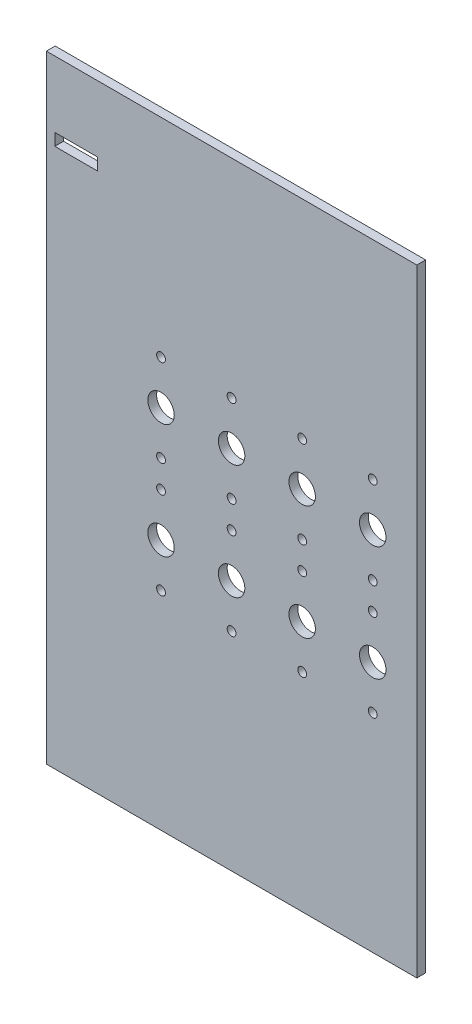
ISO-10303-21;
HEADER;
FILE_DESCRIPTION(('STEP AP214'),'2;1');
FILE_NAME('part.step','',(''),(''),'','','');
FILE_SCHEMA(('AUTOMOTIVE_DESIGN { 1 0 10303 214 1 1 1 1 }'));
ENDSEC;
DATA;
#1=APPLICATION_CONTEXT('core data for automotive mechanical design processes');
#2=APPLICATION_PROTOCOL_DEFINITION('international standard','automotive_design',2000,#1);
#3=PRODUCT_CONTEXT('',#1,'mechanical');
#4=PRODUCT('Part','Part','',(#3));
#5=PRODUCT_RELATED_PRODUCT_CATEGORY('part','',(#4));
#6=PRODUCT_DEFINITION_FORMATION('','',#4);
#7=PRODUCT_DEFINITION_CONTEXT('part definition',#1,'design');
#8=PRODUCT_DEFINITION('design','',#6,#7);
#9=PRODUCT_DEFINITION_SHAPE('','',#8);
#10=(LENGTH_UNIT() NAMED_UNIT(*) SI_UNIT(.MILLI.,.METRE.));
#11=(NAMED_UNIT(*) PLANE_ANGLE_UNIT() SI_UNIT($,.RADIAN.));
#12=(NAMED_UNIT(*) SI_UNIT($,.STERADIAN.) SOLID_ANGLE_UNIT());
#13=UNCERTAINTY_MEASURE_WITH_UNIT(LENGTH_MEASURE(1.E-05),#10,'distance_accuracy_value','');
#14=(GEOMETRIC_REPRESENTATION_CONTEXT(3) GLOBAL_UNCERTAINTY_ASSIGNED_CONTEXT((#13)) GLOBAL_UNIT_ASSIGNED_CONTEXT((#10,
#11,#12)) REPRESENTATION_CONTEXT('',''));
#15=CARTESIAN_POINT('',(0.,0.,0.));
#16=DIRECTION('',(0.,0.,1.));
#17=DIRECTION('',(1.,0.,0.));
#18=AXIS2_PLACEMENT_3D('',#15,#16,#17);
#19=CARTESIAN_POINT('',(0.,0.,10.));
#20=DIRECTION('',(0.,0.,1.));
#21=DIRECTION('',(1.,0.,0.));
#22=AXIS2_PLACEMENT_3D('',#19,#20,#21);
#23=PLANE('',#22);
#24=DIRECTION('',(0.,-1.,0.));
#25=VECTOR('',#24,1.);
#26=CARTESIAN_POINT('',(57.76,261.29,10.));
#27=LINE('',#26,#25);
#28=CARTESIAN_POINT('',(57.76,275.,10.));
#29=VERTEX_POINT('',#28);
#30=CARTESIAN_POINT('',(57.76,261.29,10.));
#31=VERTEX_POINT('',#30);
#32=EDGE_CURVE('E106',#29,#31,#27,.T.);
#33=ORIENTED_EDGE('',*,*,#32,.T.);
#34=DIRECTION('',(-1.,0.,0.));
#35=VECTOR('',#34,1.);
#36=CARTESIAN_POINT('',(9.53,261.29,10.));
#37=LINE('',#36,#35);
#38=CARTESIAN_POINT('',(9.53,261.29,10.));
#39=VERTEX_POINT('',#38);
#40=EDGE_CURVE('E113',#31,#39,#37,.T.);
#41=ORIENTED_EDGE('',*,*,#40,.T.);
#42=DIRECTION('',(0.,1.,0.));
#43=VECTOR('',#42,1.);
#44=CARTESIAN_POINT('',(9.53,261.29,10.));
#45=LINE('',#44,#43);
#46=CARTESIAN_POINT('',(9.53,275.,10.));
#47=VERTEX_POINT('',#46);
#48=EDGE_CURVE('E53',#39,#47,#45,.T.);
#49=ORIENTED_EDGE('',*,*,#48,.T.);
#50=DIRECTION('',(1.,0.,0.));
#51=VECTOR('',#50,1.);
#52=CARTESIAN_POINT('',(9.53,275.,10.));
#53=LINE('',#52,#51);
#54=EDGE_CURVE('E115',#47,#29,#53,.T.);
#55=ORIENTED_EDGE('',*,*,#54,.T.);
#56=EDGE_LOOP('',(#33,#41,#49,#55));
#57=FACE_BOUND('',#56,.T.);
#58=CARTESIAN_POINT('',(290.,-64.9999999999999,10.));
#59=DIRECTION('',(0.,0.,1.));
#60=DIRECTION('',(1.,0.,0.));
#61=AXIS2_PLACEMENT_3D('',#58,#59,#60);
#62=CIRCLE('',#61,15.0000000000001);
#63=CARTESIAN_POINT('',(305.,-64.9999999999999,10.));
#64=VERTEX_POINT('',#63);
#65=EDGE_CURVE('E148',#64,#64,#62,.T.);
#66=ORIENTED_EDGE('',*,*,#65,.F.);
#67=EDGE_LOOP('',(#66));
#68=FACE_BOUND('',#67,.T.);
#69=CARTESIAN_POINT('',(129.999999999999,-64.9999999999999,10.));
#70=DIRECTION('',(0.,0.,1.));
#71=DIRECTION('',(1.,0.,0.));
#72=AXIS2_PLACEMENT_3D('',#69,#70,#71);
#73=CIRCLE('',#72,15.0000000000001);
#74=CARTESIAN_POINT('',(145.,-64.9999999999999,10.));
#75=VERTEX_POINT('',#74);
#76=EDGE_CURVE('E158',#75,#75,#73,.T.);
#77=ORIENTED_EDGE('',*,*,#76,.F.);
#78=EDGE_LOOP('',(#77));
#79=FACE_BOUND('',#78,.T.);
#80=CARTESIAN_POINT('',(370.,-114.5,10.));
#81=DIRECTION('',(0.,0.,1.));
#82=DIRECTION('',(1.,0.,0.));
#83=AXIS2_PLACEMENT_3D('',#80,#81,#82);
#84=CIRCLE('',#83,4.99999999999989);
#85=CARTESIAN_POINT('',(375.,-114.5,10.));
#86=VERTEX_POINT('',#85);
#87=EDGE_CURVE('E168',#86,#86,#84,.T.);
#88=ORIENTED_EDGE('',*,*,#87,.F.);
#89=EDGE_LOOP('',(#88));
#90=FACE_BOUND('',#89,.T.);
#91=CARTESIAN_POINT('',(290.,-114.5,10.));
#92=DIRECTION('',(0.,0.,1.));
#93=DIRECTION('',(1.,0.,0.));
#94=AXIS2_PLACEMENT_3D('',#91,#92,#93);
#95=CIRCLE('',#94,4.99999999999989);
#96=CARTESIAN_POINT('',(294.999999999999,-114.5,10.));
#97=VERTEX_POINT('',#96);
#98=EDGE_CURVE('E185',#97,#97,#95,.T.);
#99=ORIENTED_EDGE('',*,*,#98,.F.);
#100=EDGE_LOOP('',(#99));
#101=FACE_BOUND('',#100,.T.);
#102=CARTESIAN_POINT('',(210.,-114.5,10.));
#103=DIRECTION('',(0.,0.,1.));
#104=DIRECTION('',(1.,0.,0.));
#105=AXIS2_PLACEMENT_3D('',#102,#103,#104);
#106=CIRCLE('',#105,4.99999999999989);
#107=CARTESIAN_POINT('',(214.999999999999,-114.5,10.));
#108=VERTEX_POINT('',#107);
#109=EDGE_CURVE('E194',#108,#108,#106,.T.);
#110=ORIENTED_EDGE('',*,*,#109,.F.);
#111=EDGE_LOOP('',(#110));
#112=FACE_BOUND('',#111,.T.);
#113=CARTESIAN_POINT('',(129.999999999999,-114.5,10.));
#114=DIRECTION('',(0.,0.,1.));
#115=DIRECTION('',(1.,0.,0.));
#116=AXIS2_PLACEMENT_3D('',#113,#114,#115);
#117=CIRCLE('',#116,4.99999999999989);
#118=CARTESIAN_POINT('',(134.999999999999,-114.5,10.));
#119=VERTEX_POINT('',#118);
#120=EDGE_CURVE('E206',#119,#119,#117,.T.);
#121=ORIENTED_EDGE('',*,*,#120,.F.);
#122=EDGE_LOOP('',(#121));
#123=FACE_BOUND('',#122,.T.);
#124=CARTESIAN_POINT('',(290.,64.9999999999999,10.));
#125=DIRECTION('',(0.,0.,1.));
#126=DIRECTION('',(1.,0.,0.));
#127=AXIS2_PLACEMENT_3D('',#124,#125,#126);
#128=CIRCLE('',#127,15.0000000000001);
#129=CARTESIAN_POINT('',(305.,64.9999999999999,10.));
#130=VERTEX_POINT('',#129);
#131=EDGE_CURVE('E217',#130,#130,#128,.T.);
#132=ORIENTED_EDGE('',*,*,#131,.F.);
#133=EDGE_LOOP('',(#132));
#134=FACE_BOUND('',#133,.T.);
#135=CARTESIAN_POINT('',(129.999999999999,64.9999999999999,10.));
#136=DIRECTION('',(0.,0.,1.));
#137=DIRECTION('',(1.,0.,0.));
#138=AXIS2_PLACEMENT_3D('',#135,#136,#137);
#139=CIRCLE('',#138,15.0000000000001);
#140=CARTESIAN_POINT('',(145.,64.9999999999999,10.));
#141=VERTEX_POINT('',#140);
#142=EDGE_CURVE('E230',#141,#141,#139,.T.);
#143=ORIENTED_EDGE('',*,*,#142,.F.);
#144=EDGE_LOOP('',(#143));
#145=FACE_BOUND('',#144,.T.);
#146=CARTESIAN_POINT('',(370.,114.5,10.));
#147=DIRECTION('',(0.,0.,1.));
#148=DIRECTION('',(1.,0.,0.));
#149=AXIS2_PLACEMENT_3D('',#146,#147,#148);
#150=CIRCLE('',#149,4.99999999999989);
#151=CARTESIAN_POINT('',(375.,114.5,10.));
#152=VERTEX_POINT('',#151);
#153=EDGE_CURVE('E242',#152,#152,#150,.T.);
#154=ORIENTED_EDGE('',*,*,#153,.F.);
#155=EDGE_LOOP('',(#154));
#156=FACE_BOUND('',#155,.T.);
#157=CARTESIAN_POINT('',(290.,114.5,10.));
#158=DIRECTION('',(0.,0.,1.));
#159=DIRECTION('',(1.,0.,0.));
#160=AXIS2_PLACEMENT_3D('',#157,#158,#159);
#161=CIRCLE('',#160,4.99999999999989);
#162=CARTESIAN_POINT('',(294.999999999999,114.5,10.));
#163=VERTEX_POINT('',#162);
#164=EDGE_CURVE('E255',#163,#163,#161,.T.);
#165=ORIENTED_EDGE('',*,*,#164,.F.);
#166=EDGE_LOOP('',(#165));
#167=FACE_BOUND('',#166,.T.);
#168=CARTESIAN_POINT('',(210.,114.5,10.));
#169=DIRECTION('',(0.,0.,1.));
#170=DIRECTION('',(1.,0.,0.));
#171=AXIS2_PLACEMENT_3D('',#168,#169,#170);
#172=CIRCLE('',#171,4.99999999999989);
#173=CARTESIAN_POINT('',(214.999999999999,114.5,10.));
#174=VERTEX_POINT('',#173);
#175=EDGE_CURVE('E266',#174,#174,#172,.T.);
#176=ORIENTED_EDGE('',*,*,#175,.F.);
#177=EDGE_LOOP('',(#176));
#178=FACE_BOUND('',#177,.T.);
#179=CARTESIAN_POINT('',(129.999999999999,114.5,10.));
#180=DIRECTION('',(0.,0.,1.));
#181=DIRECTION('',(1.,0.,0.));
#182=AXIS2_PLACEMENT_3D('',#179,#180,#181);
#183=CIRCLE('',#182,4.99999999999989);
#184=CARTESIAN_POINT('',(134.999999999999,114.5,10.));
#185=VERTEX_POINT('',#184);
#186=EDGE_CURVE('E279',#185,#185,#183,.T.);
#187=ORIENTED_EDGE('',*,*,#186,.F.);
#188=EDGE_LOOP('',(#187));
#189=FACE_BOUND('',#188,.T.);
#190=DIRECTION('',(0.,-1.,0.));
#191=VECTOR('',#190,1.);
#192=CARTESIAN_POINT('',(0.,350.,10.));
#193=LINE('',#192,#191);
#194=CARTESIAN_POINT('',(0.,350.,10.));
#195=VERTEX_POINT('',#194);
#196=CARTESIAN_POINT('',(0.,-350.,10.));
#197=VERTEX_POINT('',#196);
#198=EDGE_CURVE('E283',#195,#197,#193,.T.);
#199=ORIENTED_EDGE('',*,*,#198,.T.);
#200=DIRECTION('',(1.,0.,0.));
#201=VECTOR('',#200,1.);
#202=CARTESIAN_POINT('',(0.,-350.,10.));
#203=LINE('',#202,#201);
#204=CARTESIAN_POINT('',(419.999999999999,-350.,10.));
#205=VERTEX_POINT('',#204);
#206=EDGE_CURVE('E290',#197,#205,#203,.T.);
#207=ORIENTED_EDGE('',*,*,#206,.T.);
#208=DIRECTION('',(0.,1.,0.));
#209=VECTOR('',#208,1.);
#210=CARTESIAN_POINT('',(419.999999999999,-350.,10.));
#211=LINE('',#210,#209);
#212=CARTESIAN_POINT('',(419.999999999999,350.,10.));
#213=VERTEX_POINT('',#212);
#214=EDGE_CURVE('E286',#205,#213,#211,.T.);
#215=ORIENTED_EDGE('',*,*,#214,.T.);
#216=DIRECTION('',(-1.,0.,0.));
#217=VECTOR('',#216,1.);
#218=CARTESIAN_POINT('',(419.999999999999,350.,10.));
#219=LINE('',#218,#217);
#220=EDGE_CURVE('E295',#213,#195,#219,.T.);
#221=ORIENTED_EDGE('',*,*,#220,.T.);
#222=EDGE_LOOP('',(#199,#207,#215,#221));
#223=FACE_BOUND('',#222,.T.);
#224=CARTESIAN_POINT('',(129.999999999999,15.4999999999998,10.));
#225=DIRECTION('',(0.,0.,1.));
#226=DIRECTION('',(1.,0.,0.));
#227=AXIS2_PLACEMENT_3D('',#224,#225,#226);
#228=CIRCLE('',#227,4.99999999999989);
#229=CARTESIAN_POINT('',(134.999999999999,15.4999999999998,10.));
#230=VERTEX_POINT('',#229);
#231=EDGE_CURVE('E275',#230,#230,#228,.T.);
#232=ORIENTED_EDGE('',*,*,#231,.F.);
#233=EDGE_LOOP('',(#232));
#234=FACE_BOUND('',#233,.T.);
#235=CARTESIAN_POINT('',(210.,15.4999999999998,10.));
#236=DIRECTION('',(0.,0.,1.));
#237=DIRECTION('',(1.,0.,0.));
#238=AXIS2_PLACEMENT_3D('',#235,#236,#237);
#239=CIRCLE('',#238,4.99999999999989);
#240=CARTESIAN_POINT('',(214.999999999999,15.4999999999998,10.));
#241=VERTEX_POINT('',#240);
#242=EDGE_CURVE('E257',#241,#241,#239,.T.);
#243=ORIENTED_EDGE('',*,*,#242,.F.);
#244=EDGE_LOOP('',(#243));
#245=FACE_BOUND('',#244,.T.);
#246=CARTESIAN_POINT('',(290.,15.4999999999998,10.));
#247=DIRECTION('',(0.,0.,1.));
#248=DIRECTION('',(1.,0.,0.));
#249=AXIS2_PLACEMENT_3D('',#246,#247,#248);
#250=CIRCLE('',#249,4.99999999999989);
#251=CARTESIAN_POINT('',(294.999999999999,15.4999999999998,10.));
#252=VERTEX_POINT('',#251);
#253=EDGE_CURVE('E248',#252,#252,#250,.T.);
#254=ORIENTED_EDGE('',*,*,#253,.F.);
#255=EDGE_LOOP('',(#254));
#256=FACE_BOUND('',#255,.T.);
#257=CARTESIAN_POINT('',(370.,15.4999999999998,10.));
#258=DIRECTION('',(0.,0.,1.));
#259=DIRECTION('',(1.,0.,0.));
#260=AXIS2_PLACEMENT_3D('',#257,#258,#259);
#261=CIRCLE('',#260,4.99999999999989);
#262=CARTESIAN_POINT('',(375.,15.4999999999998,10.));
#263=VERTEX_POINT('',#262);
#264=EDGE_CURVE('E237',#263,#263,#261,.T.);
#265=ORIENTED_EDGE('',*,*,#264,.F.);
#266=EDGE_LOOP('',(#265));
#267=FACE_BOUND('',#266,.T.);
#268=CARTESIAN_POINT('',(210.,64.9999999999999,10.));
#269=DIRECTION('',(0.,0.,1.));
#270=DIRECTION('',(1.,0.,0.));
#271=AXIS2_PLACEMENT_3D('',#268,#269,#270);
#272=CIRCLE('',#271,15.0000000000001);
#273=CARTESIAN_POINT('',(225.,64.9999999999999,10.));
#274=VERTEX_POINT('',#273);
#275=EDGE_CURVE('E221',#274,#274,#272,.T.);
#276=ORIENTED_EDGE('',*,*,#275,.F.);
#277=EDGE_LOOP('',(#276));
#278=FACE_BOUND('',#277,.T.);
#279=CARTESIAN_POINT('',(370.,64.9999999999999,10.));
#280=DIRECTION('',(0.,0.,1.));
#281=DIRECTION('',(1.,0.,0.));
#282=AXIS2_PLACEMENT_3D('',#279,#280,#281);
#283=CIRCLE('',#282,15.0000000000001);
#284=CARTESIAN_POINT('',(385.,64.9999999999999,10.));
#285=VERTEX_POINT('',#284);
#286=EDGE_CURVE('E215',#285,#285,#283,.T.);
#287=ORIENTED_EDGE('',*,*,#286,.F.);
#288=EDGE_LOOP('',(#287));
#289=FACE_BOUND('',#288,.T.);
#290=CARTESIAN_POINT('',(129.999999999999,-15.4999999999998,10.));
#291=DIRECTION('',(0.,0.,1.));
#292=DIRECTION('',(1.,0.,0.));
#293=AXIS2_PLACEMENT_3D('',#290,#291,#292);
#294=CIRCLE('',#293,4.99999999999989);
#295=CARTESIAN_POINT('',(134.999999999999,-15.4999999999998,10.));
#296=VERTEX_POINT('',#295);
#297=EDGE_CURVE('E199',#296,#296,#294,.T.);
#298=ORIENTED_EDGE('',*,*,#297,.F.);
#299=EDGE_LOOP('',(#298));
#300=FACE_BOUND('',#299,.T.);
#301=CARTESIAN_POINT('',(210.,-15.4999999999998,10.));
#302=DIRECTION('',(0.,0.,1.));
#303=DIRECTION('',(1.,0.,0.));
#304=AXIS2_PLACEMENT_3D('',#301,#302,#303);
#305=CIRCLE('',#304,4.99999999999989);
#306=CARTESIAN_POINT('',(214.999999999999,-15.4999999999998,10.));
#307=VERTEX_POINT('',#306);
#308=EDGE_CURVE('E189',#307,#307,#305,.T.);
#309=ORIENTED_EDGE('',*,*,#308,.F.);
#310=EDGE_LOOP('',(#309));
#311=FACE_BOUND('',#310,.T.);
#312=CARTESIAN_POINT('',(290.,-15.4999999999998,10.));
#313=DIRECTION('',(0.,0.,1.));
#314=DIRECTION('',(1.,0.,0.));
#315=AXIS2_PLACEMENT_3D('',#312,#313,#314);
#316=CIRCLE('',#315,4.99999999999989);
#317=CARTESIAN_POINT('',(294.999999999999,-15.4999999999998,10.));
#318=VERTEX_POINT('',#317);
#319=EDGE_CURVE('E177',#318,#318,#316,.T.);
#320=ORIENTED_EDGE('',*,*,#319,.F.);
#321=EDGE_LOOP('',(#320));
#322=FACE_BOUND('',#321,.T.);
#323=CARTESIAN_POINT('',(370.,-15.4999999999998,10.));
#324=DIRECTION('',(0.,0.,1.));
#325=DIRECTION('',(1.,0.,0.));
#326=AXIS2_PLACEMENT_3D('',#323,#324,#325);
#327=CIRCLE('',#326,4.99999999999989);
#328=CARTESIAN_POINT('',(375.,-15.4999999999998,10.));
#329=VERTEX_POINT('',#328);
#330=EDGE_CURVE('E163',#329,#329,#327,.T.);
#331=ORIENTED_EDGE('',*,*,#330,.F.);
#332=EDGE_LOOP('',(#331));
#333=FACE_BOUND('',#332,.T.);
#334=CARTESIAN_POINT('',(210.,-64.9999999999999,10.));
#335=DIRECTION('',(0.,0.,1.));
#336=DIRECTION('',(1.,0.,0.));
#337=AXIS2_PLACEMENT_3D('',#334,#335,#336);
#338=CIRCLE('',#337,15.0000000000001);
#339=CARTESIAN_POINT('',(225.,-64.9999999999999,10.));
#340=VERTEX_POINT('',#339);
#341=EDGE_CURVE('E155',#340,#340,#338,.T.);
#342=ORIENTED_EDGE('',*,*,#341,.F.);
#343=EDGE_LOOP('',(#342));
#344=FACE_BOUND('',#343,.T.);
#345=CARTESIAN_POINT('',(370.,-64.9999999999999,10.));
#346=DIRECTION('',(0.,0.,1.));
#347=DIRECTION('',(1.,0.,0.));
#348=AXIS2_PLACEMENT_3D('',#345,#346,#347);
#349=CIRCLE('',#348,15.0000000000001);
#350=CARTESIAN_POINT('',(385.,-64.9999999999999,10.));
#351=VERTEX_POINT('',#350);
#352=EDGE_CURVE('E136',#351,#351,#349,.T.);
#353=ORIENTED_EDGE('',*,*,#352,.F.);
#354=EDGE_LOOP('',(#353));
#355=FACE_BOUND('',#354,.T.);
#356=ADVANCED_FACE('F39',(#57,#68,#79,#90,#101,#112,#123,#134,#145,#156,#167,#178,#189,#223,
#234,#245,#256,#267,#278,#289,#300,#311,#322,#333,#344,#355),#23,.T.);
#357=CARTESIAN_POINT('',(0.,0.,0.));
#358=DIRECTION('',(0.,0.,1.));
#359=DIRECTION('',(1.,0.,0.));
#360=AXIS2_PLACEMENT_3D('',#357,#358,#359);
#361=PLANE('',#360);
#362=DIRECTION('',(-1.,0.,0.));
#363=VECTOR('',#362,1.);
#364=CARTESIAN_POINT('',(9.53,261.29,0.));
#365=LINE('',#364,#363);
#366=CARTESIAN_POINT('',(57.76,261.29,0.));
#367=VERTEX_POINT('',#366);
#368=CARTESIAN_POINT('',(9.53,261.29,0.));
#369=VERTEX_POINT('',#368);
#370=EDGE_CURVE('E128',#367,#369,#365,.T.);
#371=ORIENTED_EDGE('',*,*,#370,.F.);
#372=DIRECTION('',(0.,-1.,0.));
#373=VECTOR('',#372,1.);
#374=CARTESIAN_POINT('',(57.76,261.29,0.));
#375=LINE('',#374,#373);
#376=CARTESIAN_POINT('',(57.76,275.,0.));
#377=VERTEX_POINT('',#376);
#378=EDGE_CURVE('E62',#377,#367,#375,.T.);
#379=ORIENTED_EDGE('',*,*,#378,.F.);
#380=DIRECTION('',(1.,0.,0.));
#381=VECTOR('',#380,1.);
#382=CARTESIAN_POINT('',(9.53,275.,0.));
#383=LINE('',#382,#381);
#384=CARTESIAN_POINT('',(9.53,275.,0.));
#385=VERTEX_POINT('',#384);
#386=EDGE_CURVE('E122',#385,#377,#383,.T.);
#387=ORIENTED_EDGE('',*,*,#386,.F.);
#388=DIRECTION('',(0.,1.,0.));
#389=VECTOR('',#388,1.);
#390=CARTESIAN_POINT('',(9.53,261.29,0.));
#391=LINE('',#390,#389);
#392=EDGE_CURVE('E124',#369,#385,#391,.T.);
#393=ORIENTED_EDGE('',*,*,#392,.F.);
#394=EDGE_LOOP('',(#371,#379,#387,#393));
#395=FACE_BOUND('',#394,.T.);
#396=DIRECTION('',(0.,-1.,0.));
#397=VECTOR('',#396,1.);
#398=CARTESIAN_POINT('',(0.,350.,0.));
#399=LINE('',#398,#397);
#400=CARTESIAN_POINT('',(0.,350.,0.));
#401=VERTEX_POINT('',#400);
#402=CARTESIAN_POINT('',(0.,-350.,0.));
#403=VERTEX_POINT('',#402);
#404=EDGE_CURVE('E281',#401,#403,#399,.T.);
#405=ORIENTED_EDGE('',*,*,#404,.F.);
#406=DIRECTION('',(-1.,0.,0.));
#407=VECTOR('',#406,1.);
#408=CARTESIAN_POINT('',(419.999999999999,350.,0.));
#409=LINE('',#408,#407);
#410=CARTESIAN_POINT('',(419.999999999999,350.,0.));
#411=VERTEX_POINT('',#410);
#412=EDGE_CURVE('E288',#411,#401,#409,.T.);
#413=ORIENTED_EDGE('',*,*,#412,.F.);
#414=DIRECTION('',(0.,1.,0.));
#415=VECTOR('',#414,1.);
#416=CARTESIAN_POINT('',(419.999999999999,-350.,0.));
#417=LINE('',#416,#415);
#418=CARTESIAN_POINT('',(419.999999999999,-350.,0.));
#419=VERTEX_POINT('',#418);
#420=EDGE_CURVE('E298',#419,#411,#417,.T.);
#421=ORIENTED_EDGE('',*,*,#420,.F.);
#422=DIRECTION('',(1.,0.,0.));
#423=VECTOR('',#422,1.);
#424=CARTESIAN_POINT('',(0.,-350.,0.));
#425=LINE('',#424,#423);
#426=EDGE_CURVE('E297',#403,#419,#425,.T.);
#427=ORIENTED_EDGE('',*,*,#426,.F.);
#428=EDGE_LOOP('',(#405,#413,#421,#427));
#429=FACE_BOUND('',#428,.T.);
#430=CARTESIAN_POINT('',(129.999999999999,114.5,0.));
#431=DIRECTION('',(0.,0.,1.));
#432=DIRECTION('',(1.,0.,0.));
#433=AXIS2_PLACEMENT_3D('',#430,#431,#432);
#434=CIRCLE('',#433,4.99999999999989);
#435=CARTESIAN_POINT('',(134.999999999999,114.5,0.));
#436=VERTEX_POINT('',#435);
#437=EDGE_CURVE('E274',#436,#436,#434,.T.);
#438=ORIENTED_EDGE('',*,*,#437,.T.);
#439=EDGE_LOOP('',(#438));
#440=FACE_BOUND('',#439,.T.);
#441=CARTESIAN_POINT('',(129.999999999999,15.4999999999998,0.));
#442=DIRECTION('',(0.,0.,1.));
#443=DIRECTION('',(1.,0.,0.));
#444=AXIS2_PLACEMENT_3D('',#441,#442,#443);
#445=CIRCLE('',#444,4.99999999999989);
#446=CARTESIAN_POINT('',(134.999999999999,15.4999999999998,0.));
#447=VERTEX_POINT('',#446);
#448=EDGE_CURVE('E267',#447,#447,#445,.T.);
#449=ORIENTED_EDGE('',*,*,#448,.T.);
#450=EDGE_LOOP('',(#449));
#451=FACE_BOUND('',#450,.T.);
#452=CARTESIAN_POINT('',(210.,114.5,0.));
#453=DIRECTION('',(0.,0.,1.));
#454=DIRECTION('',(1.,0.,0.));
#455=AXIS2_PLACEMENT_3D('',#452,#453,#454);
#456=CIRCLE('',#455,4.99999999999989);
#457=CARTESIAN_POINT('',(214.999999999999,114.5,0.));
#458=VERTEX_POINT('',#457);
#459=EDGE_CURVE('E263',#458,#458,#456,.T.);
#460=ORIENTED_EDGE('',*,*,#459,.T.);
#461=EDGE_LOOP('',(#460));
#462=FACE_BOUND('',#461,.T.);
#463=CARTESIAN_POINT('',(210.,15.4999999999998,0.));
#464=DIRECTION('',(0.,0.,1.));
#465=DIRECTION('',(1.,0.,0.));
#466=AXIS2_PLACEMENT_3D('',#463,#464,#465);
#467=CIRCLE('',#466,4.99999999999989);
#468=CARTESIAN_POINT('',(214.999999999999,15.4999999999998,0.));
#469=VERTEX_POINT('',#468);
#470=EDGE_CURVE('E260',#469,#469,#467,.T.);
#471=ORIENTED_EDGE('',*,*,#470,.T.);
#472=EDGE_LOOP('',(#471));
#473=FACE_BOUND('',#472,.T.);
#474=CARTESIAN_POINT('',(290.,114.5,0.));
#475=DIRECTION('',(0.,0.,1.));
#476=DIRECTION('',(1.,0.,0.));
#477=AXIS2_PLACEMENT_3D('',#474,#475,#476);
#478=CIRCLE('',#477,4.99999999999989);
#479=CARTESIAN_POINT('',(294.999999999999,114.5,0.));
#480=VERTEX_POINT('',#479);
#481=EDGE_CURVE('E253',#480,#480,#478,.T.);
#482=ORIENTED_EDGE('',*,*,#481,.T.);
#483=EDGE_LOOP('',(#482));
#484=FACE_BOUND('',#483,.T.);
#485=CARTESIAN_POINT('',(290.,15.4999999999998,0.));
#486=DIRECTION('',(0.,0.,1.));
#487=DIRECTION('',(1.,0.,0.));
#488=AXIS2_PLACEMENT_3D('',#485,#486,#487);
#489=CIRCLE('',#488,4.99999999999989);
#490=CARTESIAN_POINT('',(294.999999999999,15.4999999999998,0.));
#491=VERTEX_POINT('',#490);
#492=EDGE_CURVE('E245',#491,#491,#489,.T.);
#493=ORIENTED_EDGE('',*,*,#492,.T.);
#494=EDGE_LOOP('',(#493));
#495=FACE_BOUND('',#494,.T.);
#496=CARTESIAN_POINT('',(370.,114.5,0.));
#497=DIRECTION('',(0.,0.,1.));
#498=DIRECTION('',(1.,0.,0.));
#499=AXIS2_PLACEMENT_3D('',#496,#497,#498);
#500=CIRCLE('',#499,4.99999999999989);
#501=CARTESIAN_POINT('',(375.,114.5,0.));
#502=VERTEX_POINT('',#501);
#503=EDGE_CURVE('E239',#502,#502,#500,.T.);
#504=ORIENTED_EDGE('',*,*,#503,.T.);
#505=EDGE_LOOP('',(#504));
#506=FACE_BOUND('',#505,.T.);
#507=CARTESIAN_POINT('',(370.,15.4999999999998,0.));
#508=DIRECTION('',(0.,0.,1.));
#509=DIRECTION('',(1.,0.,0.));
#510=AXIS2_PLACEMENT_3D('',#507,#508,#509);
#511=CIRCLE('',#510,4.99999999999989);
#512=CARTESIAN_POINT('',(375.,15.4999999999998,0.));
#513=VERTEX_POINT('',#512);
#514=EDGE_CURVE('E233',#513,#513,#511,.T.);
#515=ORIENTED_EDGE('',*,*,#514,.T.);
#516=EDGE_LOOP('',(#515));
#517=FACE_BOUND('',#516,.T.);
#518=CARTESIAN_POINT('',(129.999999999999,64.9999999999999,0.));
#519=DIRECTION('',(0.,0.,1.));
#520=DIRECTION('',(1.,0.,0.));
#521=AXIS2_PLACEMENT_3D('',#518,#519,#520);
#522=CIRCLE('',#521,15.0000000000001);
#523=CARTESIAN_POINT('',(145.,64.9999999999999,0.));
#524=VERTEX_POINT('',#523);
#525=EDGE_CURVE('E227',#524,#524,#522,.T.);
#526=ORIENTED_EDGE('',*,*,#525,.T.);
#527=EDGE_LOOP('',(#526));
#528=FACE_BOUND('',#527,.T.);
#529=CARTESIAN_POINT('',(210.,64.9999999999999,0.));
#530=DIRECTION('',(0.,0.,1.));
#531=DIRECTION('',(1.,0.,0.));
#532=AXIS2_PLACEMENT_3D('',#529,#530,#531);
#533=CIRCLE('',#532,15.0000000000001);
#534=CARTESIAN_POINT('',(225.,64.9999999999999,0.));
#535=VERTEX_POINT('',#534);
#536=EDGE_CURVE('E222',#535,#535,#533,.T.);
#537=ORIENTED_EDGE('',*,*,#536,.T.);
#538=EDGE_LOOP('',(#537));
#539=FACE_BOUND('',#538,.T.);
#540=CARTESIAN_POINT('',(290.,64.9999999999999,0.));
#541=DIRECTION('',(0.,0.,1.));
#542=DIRECTION('',(1.,0.,0.));
#543=AXIS2_PLACEMENT_3D('',#540,#541,#542);
#544=CIRCLE('',#543,15.0000000000001);
#545=CARTESIAN_POINT('',(305.,64.9999999999999,0.));
#546=VERTEX_POINT('',#545);
#547=EDGE_CURVE('E214',#546,#546,#544,.T.);
#548=ORIENTED_EDGE('',*,*,#547,.T.);
#549=EDGE_LOOP('',(#548));
#550=FACE_BOUND('',#549,.T.);
#551=CARTESIAN_POINT('',(370.,64.9999999999999,0.));
#552=DIRECTION('',(0.,0.,1.));
#553=DIRECTION('',(1.,0.,0.));
#554=AXIS2_PLACEMENT_3D('',#551,#552,#553);
#555=CIRCLE('',#554,15.0000000000001);
#556=CARTESIAN_POINT('',(385.,64.9999999999999,0.));
#557=VERTEX_POINT('',#556);
#558=EDGE_CURVE('E207',#557,#557,#555,.T.);
#559=ORIENTED_EDGE('',*,*,#558,.T.);
#560=EDGE_LOOP('',(#559));
#561=FACE_BOUND('',#560,.T.);
#562=CARTESIAN_POINT('',(129.999999999999,-114.5,0.));
#563=DIRECTION('',(0.,0.,1.));
#564=DIRECTION('',(1.,0.,0.));
#565=AXIS2_PLACEMENT_3D('',#562,#563,#564);
#566=CIRCLE('',#565,4.99999999999989);
#567=CARTESIAN_POINT('',(134.999999999999,-114.5,0.));
#568=VERTEX_POINT('',#567);
#569=EDGE_CURVE('E201',#568,#568,#566,.T.);
#570=ORIENTED_EDGE('',*,*,#569,.T.);
#571=EDGE_LOOP('',(#570));
#572=FACE_BOUND('',#571,.T.);
#573=CARTESIAN_POINT('',(129.999999999999,-15.4999999999998,0.));
#574=DIRECTION('',(0.,0.,1.));
#575=DIRECTION('',(1.,0.,0.));
#576=AXIS2_PLACEMENT_3D('',#573,#574,#575);
#577=CIRCLE('',#576,4.99999999999989);
#578=CARTESIAN_POINT('',(134.999999999999,-15.4999999999998,0.));
#579=VERTEX_POINT('',#578);
#580=EDGE_CURVE('E197',#579,#579,#577,.T.);
#581=ORIENTED_EDGE('',*,*,#580,.T.);
#582=EDGE_LOOP('',(#581));
#583=FACE_BOUND('',#582,.T.);
#584=CARTESIAN_POINT('',(210.,-114.5,0.));
#585=DIRECTION('',(0.,0.,1.));
#586=DIRECTION('',(1.,0.,0.));
#587=AXIS2_PLACEMENT_3D('',#584,#585,#586);
#588=CIRCLE('',#587,4.99999999999989);
#589=CARTESIAN_POINT('',(214.999999999999,-114.5,0.));
#590=VERTEX_POINT('',#589);
#591=EDGE_CURVE('E192',#590,#590,#588,.T.);
#592=ORIENTED_EDGE('',*,*,#591,.T.);
#593=EDGE_LOOP('',(#592));
#594=FACE_BOUND('',#593,.T.);
#595=CARTESIAN_POINT('',(210.,-15.4999999999998,0.));
#596=DIRECTION('',(0.,0.,1.));
#597=DIRECTION('',(1.,0.,0.));
#598=AXIS2_PLACEMENT_3D('',#595,#596,#597);
#599=CIRCLE('',#598,4.99999999999989);
#600=CARTESIAN_POINT('',(214.999999999999,-15.4999999999998,0.));
#601=VERTEX_POINT('',#600);
#602=EDGE_CURVE('E183',#601,#601,#599,.T.);
#603=ORIENTED_EDGE('',*,*,#602,.T.);
#604=EDGE_LOOP('',(#603));
#605=FACE_BOUND('',#604,.T.);
#606=CARTESIAN_POINT('',(290.,-114.5,0.));
#607=DIRECTION('',(0.,0.,1.));
#608=DIRECTION('',(1.,0.,0.));
#609=AXIS2_PLACEMENT_3D('',#606,#607,#608);
#610=CIRCLE('',#609,4.99999999999989);
#611=CARTESIAN_POINT('',(294.999999999999,-114.5,0.));
#612=VERTEX_POINT('',#611);
#613=EDGE_CURVE('E179',#612,#612,#610,.T.);
#614=ORIENTED_EDGE('',*,*,#613,.T.);
#615=EDGE_LOOP('',(#614));
#616=FACE_BOUND('',#615,.T.);
#617=CARTESIAN_POINT('',(290.,-15.4999999999998,0.));
#618=DIRECTION('',(0.,0.,1.));
#619=DIRECTION('',(1.,0.,0.));
#620=AXIS2_PLACEMENT_3D('',#617,#618,#619);
#621=CIRCLE('',#620,4.99999999999989);
#622=CARTESIAN_POINT('',(294.999999999999,-15.4999999999998,0.));
#623=VERTEX_POINT('',#622);
#624=EDGE_CURVE('E174',#623,#623,#621,.T.);
#625=ORIENTED_EDGE('',*,*,#624,.T.);
#626=EDGE_LOOP('',(#625));
#627=FACE_BOUND('',#626,.T.);
#628=CARTESIAN_POINT('',(370.,-114.5,0.));
#629=DIRECTION('',(0.,0.,1.));
#630=DIRECTION('',(1.,0.,0.));
#631=AXIS2_PLACEMENT_3D('',#628,#629,#630);
#632=CIRCLE('',#631,4.99999999999989);
#633=CARTESIAN_POINT('',(375.,-114.5,0.));
#634=VERTEX_POINT('',#633);
#635=EDGE_CURVE('E170',#634,#634,#632,.T.);
#636=ORIENTED_EDGE('',*,*,#635,.T.);
#637=EDGE_LOOP('',(#636));
#638=FACE_BOUND('',#637,.T.);
#639=CARTESIAN_POINT('',(370.,-15.4999999999998,0.));
#640=DIRECTION('',(0.,0.,1.));
#641=DIRECTION('',(1.,0.,0.));
#642=AXIS2_PLACEMENT_3D('',#639,#640,#641);
#643=CIRCLE('',#642,4.99999999999989);
#644=CARTESIAN_POINT('',(375.,-15.4999999999998,0.));
#645=VERTEX_POINT('',#644);
#646=EDGE_CURVE('E161',#645,#645,#643,.T.);
#647=ORIENTED_EDGE('',*,*,#646,.T.);
#648=EDGE_LOOP('',(#647));
#649=FACE_BOUND('',#648,.T.);
#650=CARTESIAN_POINT('',(129.999999999999,-64.9999999999999,0.));
#651=DIRECTION('',(0.,0.,1.));
#652=DIRECTION('',(1.,0.,0.));
#653=AXIS2_PLACEMENT_3D('',#650,#651,#652);
#654=CIRCLE('',#653,15.0000000000001);
#655=CARTESIAN_POINT('',(145.,-64.9999999999999,0.));
#656=VERTEX_POINT('',#655);
#657=EDGE_CURVE('E154',#656,#656,#654,.T.);
#658=ORIENTED_EDGE('',*,*,#657,.T.);
#659=EDGE_LOOP('',(#658));
#660=FACE_BOUND('',#659,.T.);
#661=CARTESIAN_POINT('',(210.,-64.9999999999999,0.));
#662=DIRECTION('',(0.,0.,1.));
#663=DIRECTION('',(1.,0.,0.));
#664=AXIS2_PLACEMENT_3D('',#661,#662,#663);
#665=CIRCLE('',#664,15.0000000000001);
#666=CARTESIAN_POINT('',(225.,-64.9999999999999,0.));
#667=VERTEX_POINT('',#666);
#668=EDGE_CURVE('E149',#667,#667,#665,.T.);
#669=ORIENTED_EDGE('',*,*,#668,.T.);
#670=EDGE_LOOP('',(#669));
#671=FACE_BOUND('',#670,.T.);
#672=CARTESIAN_POINT('',(290.,-64.9999999999999,0.));
#673=DIRECTION('',(0.,0.,1.));
#674=DIRECTION('',(1.,0.,0.));
#675=AXIS2_PLACEMENT_3D('',#672,#673,#674);
#676=CIRCLE('',#675,15.0000000000001);
#677=CARTESIAN_POINT('',(305.,-64.9999999999999,0.));
#678=VERTEX_POINT('',#677);
#679=EDGE_CURVE('E141',#678,#678,#676,.T.);
#680=ORIENTED_EDGE('',*,*,#679,.T.);
#681=EDGE_LOOP('',(#680));
#682=FACE_BOUND('',#681,.T.);
#683=CARTESIAN_POINT('',(370.,-64.9999999999999,0.));
#684=DIRECTION('',(0.,0.,1.));
#685=DIRECTION('',(1.,0.,0.));
#686=AXIS2_PLACEMENT_3D('',#683,#684,#685);
#687=CIRCLE('',#686,15.0000000000001);
#688=CARTESIAN_POINT('',(385.,-64.9999999999999,0.));
#689=VERTEX_POINT('',#688);
#690=EDGE_CURVE('E137',#689,#689,#687,.T.);
#691=ORIENTED_EDGE('',*,*,#690,.T.);
#692=EDGE_LOOP('',(#691));
#693=FACE_BOUND('',#692,.T.);
#694=ADVANCED_FACE('F320',(#395,#429,#440,#451,#462,#473,#484,#495,#506,#517,#528,#539,#550,
#561,#572,#583,#594,#605,#616,#627,#638,#649,#660,#671,#682,#693),#361,.F.);
#695=CARTESIAN_POINT('',(0.,350.,10.));
#696=DIRECTION('',(1.,0.,0.));
#697=DIRECTION('',(0.,0.,-1.));
#698=AXIS2_PLACEMENT_3D('',#695,#696,#697);
#699=PLANE('',#698);
#700=ORIENTED_EDGE('',*,*,#404,.T.);
#701=DIRECTION('',(0.,0.,-1.));
#702=VECTOR('',#701,1.);
#703=CARTESIAN_POINT('',(0.,-350.,10.));
#704=LINE('',#703,#702);
#705=EDGE_CURVE('E11',#197,#403,#704,.T.);
#706=ORIENTED_EDGE('',*,*,#705,.F.);
#707=ORIENTED_EDGE('',*,*,#198,.F.);
#708=DIRECTION('',(0.,0.,-1.));
#709=VECTOR('',#708,1.);
#710=CARTESIAN_POINT('',(0.,350.,10.));
#711=LINE('',#710,#709);
#712=EDGE_CURVE('E294',#195,#401,#711,.T.);
#713=ORIENTED_EDGE('',*,*,#712,.T.);
#714=EDGE_LOOP('',(#700,#706,#707,#713));
#715=FACE_BOUND('',#714,.T.);
#716=ADVANCED_FACE('F41',(#715),#699,.F.);
#717=CARTESIAN_POINT('',(0.,-350.,10.));
#718=DIRECTION('',(0.,1.,0.));
#719=DIRECTION('',(0.,0.,1.));
#720=AXIS2_PLACEMENT_3D('',#717,#718,#719);
#721=PLANE('',#720);
#722=ORIENTED_EDGE('',*,*,#426,.T.);
#723=DIRECTION('',(0.,0.,-1.));
#724=VECTOR('',#723,1.);
#725=CARTESIAN_POINT('',(419.999999999999,-350.,10.));
#726=LINE('',#725,#724);
#727=EDGE_CURVE('E50',#205,#419,#726,.T.);
#728=ORIENTED_EDGE('',*,*,#727,.F.);
#729=ORIENTED_EDGE('',*,*,#206,.F.);
#730=ORIENTED_EDGE('',*,*,#705,.T.);
#731=EDGE_LOOP('',(#722,#728,#729,#730));
#732=FACE_BOUND('',#731,.T.);
#733=ADVANCED_FACE('F327',(#732),#721,.F.);
#734=CARTESIAN_POINT('',(419.999999999999,-350.,10.));
#735=DIRECTION('',(-1.,0.,0.));
#736=DIRECTION('',(0.,0.,1.));
#737=AXIS2_PLACEMENT_3D('',#734,#735,#736);
#738=PLANE('',#737);
#739=ORIENTED_EDGE('',*,*,#420,.T.);
#740=DIRECTION('',(0.,0.,-1.));
#741=VECTOR('',#740,1.);
#742=CARTESIAN_POINT('',(419.999999999999,350.,10.));
#743=LINE('',#742,#741);
#744=EDGE_CURVE('E304',#213,#411,#743,.T.);
#745=ORIENTED_EDGE('',*,*,#744,.F.);
#746=ORIENTED_EDGE('',*,*,#214,.F.);
#747=ORIENTED_EDGE('',*,*,#727,.T.);
#748=EDGE_LOOP('',(#739,#745,#746,#747));
#749=FACE_BOUND('',#748,.T.);
#750=ADVANCED_FACE('F313',(#749),#738,.F.);
#751=CARTESIAN_POINT('',(419.999999999999,350.,10.));
#752=DIRECTION('',(0.,-1.,0.));
#753=DIRECTION('',(0.,0.,-1.));
#754=AXIS2_PLACEMENT_3D('',#751,#752,#753);
#755=PLANE('',#754);
#756=ORIENTED_EDGE('',*,*,#412,.T.);
#757=ORIENTED_EDGE('',*,*,#712,.F.);
#758=ORIENTED_EDGE('',*,*,#220,.F.);
#759=ORIENTED_EDGE('',*,*,#744,.T.);
#760=EDGE_LOOP('',(#756,#757,#758,#759));
#761=FACE_BOUND('',#760,.T.);
#762=ADVANCED_FACE('F321',(#761),#755,.F.);
#763=CARTESIAN_POINT('',(129.999999999999,114.5,10.));
#764=DIRECTION('',(0.,0.,-1.));
#765=DIRECTION('',(-1.,0.,0.));
#766=AXIS2_PLACEMENT_3D('',#763,#764,#765);
#767=CYLINDRICAL_SURFACE('',#766,4.99999999999989);
#768=ORIENTED_EDGE('',*,*,#186,.T.);
#769=EDGE_LOOP('',(#768));
#770=FACE_BOUND('',#769,.T.);
#771=ORIENTED_EDGE('',*,*,#437,.F.);
#772=EDGE_LOOP('',(#771));
#773=FACE_BOUND('',#772,.T.);
#774=ADVANCED_FACE('F344',(#770,#773),#767,.F.);
#775=CARTESIAN_POINT('',(129.999999999999,15.4999999999998,10.));
#776=DIRECTION('',(0.,0.,-1.));
#777=DIRECTION('',(-1.,0.,0.));
#778=AXIS2_PLACEMENT_3D('',#775,#776,#777);
#779=CYLINDRICAL_SURFACE('',#778,4.99999999999989);
#780=ORIENTED_EDGE('',*,*,#231,.T.);
#781=EDGE_LOOP('',(#780));
#782=FACE_BOUND('',#781,.T.);
#783=ORIENTED_EDGE('',*,*,#448,.F.);
#784=EDGE_LOOP('',(#783));
#785=FACE_BOUND('',#784,.T.);
#786=ADVANCED_FACE('F351',(#782,#785),#779,.F.);
#787=CARTESIAN_POINT('',(210.,114.5,10.));
#788=DIRECTION('',(0.,0.,-1.));
#789=DIRECTION('',(-1.,0.,0.));
#790=AXIS2_PLACEMENT_3D('',#787,#788,#789);
#791=CYLINDRICAL_SURFACE('',#790,4.99999999999989);
#792=ORIENTED_EDGE('',*,*,#175,.T.);
#793=EDGE_LOOP('',(#792));
#794=FACE_BOUND('',#793,.T.);
#795=ORIENTED_EDGE('',*,*,#459,.F.);
#796=EDGE_LOOP('',(#795));
#797=FACE_BOUND('',#796,.T.);
#798=ADVANCED_FACE('F357',(#794,#797),#791,.F.);
#799=CARTESIAN_POINT('',(210.,15.4999999999998,10.));
#800=DIRECTION('',(0.,0.,-1.));
#801=DIRECTION('',(-1.,0.,0.));
#802=AXIS2_PLACEMENT_3D('',#799,#800,#801);
#803=CYLINDRICAL_SURFACE('',#802,4.99999999999989);
#804=ORIENTED_EDGE('',*,*,#242,.T.);
#805=EDGE_LOOP('',(#804));
#806=FACE_BOUND('',#805,.T.);
#807=ORIENTED_EDGE('',*,*,#470,.F.);
#808=EDGE_LOOP('',(#807));
#809=FACE_BOUND('',#808,.T.);
#810=ADVANCED_FACE('F492',(#806,#809),#803,.F.);
#811=CARTESIAN_POINT('',(290.,114.5,10.));
#812=DIRECTION('',(0.,0.,-1.));
#813=DIRECTION('',(-1.,0.,0.));
#814=AXIS2_PLACEMENT_3D('',#811,#812,#813);
#815=CYLINDRICAL_SURFACE('',#814,4.99999999999989);
#816=ORIENTED_EDGE('',*,*,#164,.T.);
#817=EDGE_LOOP('',(#816));
#818=FACE_BOUND('',#817,.T.);
#819=ORIENTED_EDGE('',*,*,#481,.F.);
#820=EDGE_LOOP('',(#819));
#821=FACE_BOUND('',#820,.T.);
#822=ADVANCED_FACE('F487',(#818,#821),#815,.F.);
#823=CARTESIAN_POINT('',(290.,15.4999999999998,10.));
#824=DIRECTION('',(0.,0.,-1.));
#825=DIRECTION('',(-1.,0.,0.));
#826=AXIS2_PLACEMENT_3D('',#823,#824,#825);
#827=CYLINDRICAL_SURFACE('',#826,4.99999999999989);
#828=ORIENTED_EDGE('',*,*,#253,.T.);
#829=EDGE_LOOP('',(#828));
#830=FACE_BOUND('',#829,.T.);
#831=ORIENTED_EDGE('',*,*,#492,.F.);
#832=EDGE_LOOP('',(#831));
#833=FACE_BOUND('',#832,.T.);
#834=ADVANCED_FACE('F484',(#830,#833),#827,.F.);
#835=CARTESIAN_POINT('',(370.,114.5,10.));
#836=DIRECTION('',(0.,0.,-1.));
#837=DIRECTION('',(-1.,0.,0.));
#838=AXIS2_PLACEMENT_3D('',#835,#836,#837);
#839=CYLINDRICAL_SURFACE('',#838,4.99999999999989);
#840=ORIENTED_EDGE('',*,*,#153,.T.);
#841=EDGE_LOOP('',(#840));
#842=FACE_BOUND('',#841,.T.);
#843=ORIENTED_EDGE('',*,*,#503,.F.);
#844=EDGE_LOOP('',(#843));
#845=FACE_BOUND('',#844,.T.);
#846=ADVANCED_FACE('F481',(#842,#845),#839,.F.);
#847=CARTESIAN_POINT('',(370.,15.4999999999998,10.));
#848=DIRECTION('',(0.,0.,-1.));
#849=DIRECTION('',(-1.,0.,0.));
#850=AXIS2_PLACEMENT_3D('',#847,#848,#849);
#851=CYLINDRICAL_SURFACE('',#850,4.99999999999989);
#852=ORIENTED_EDGE('',*,*,#264,.T.);
#853=EDGE_LOOP('',(#852));
#854=FACE_BOUND('',#853,.T.);
#855=ORIENTED_EDGE('',*,*,#514,.F.);
#856=EDGE_LOOP('',(#855));
#857=FACE_BOUND('',#856,.T.);
#858=ADVANCED_FACE('F480',(#854,#857),#851,.F.);
#859=CARTESIAN_POINT('',(129.999999999999,64.9999999999999,10.));
#860=DIRECTION('',(0.,0.,-1.));
#861=DIRECTION('',(-1.,0.,0.));
#862=AXIS2_PLACEMENT_3D('',#859,#860,#861);
#863=CYLINDRICAL_SURFACE('',#862,15.0000000000001);
#864=ORIENTED_EDGE('',*,*,#142,.T.);
#865=EDGE_LOOP('',(#864));
#866=FACE_BOUND('',#865,.T.);
#867=ORIENTED_EDGE('',*,*,#525,.F.);
#868=EDGE_LOOP('',(#867));
#869=FACE_BOUND('',#868,.T.);
#870=ADVANCED_FACE('F471',(#866,#869),#863,.F.);
#871=CARTESIAN_POINT('',(210.,64.9999999999999,10.));
#872=DIRECTION('',(0.,0.,-1.));
#873=DIRECTION('',(-1.,0.,0.));
#874=AXIS2_PLACEMENT_3D('',#871,#872,#873);
#875=CYLINDRICAL_SURFACE('',#874,15.0000000000001);
#876=ORIENTED_EDGE('',*,*,#275,.T.);
#877=EDGE_LOOP('',(#876));
#878=FACE_BOUND('',#877,.T.);
#879=ORIENTED_EDGE('',*,*,#536,.F.);
#880=EDGE_LOOP('',(#879));
#881=FACE_BOUND('',#880,.T.);
#882=ADVANCED_FACE('F469',(#878,#881),#875,.F.);
#883=CARTESIAN_POINT('',(290.,64.9999999999999,10.));
#884=DIRECTION('',(0.,0.,-1.));
#885=DIRECTION('',(-1.,0.,0.));
#886=AXIS2_PLACEMENT_3D('',#883,#884,#885);
#887=CYLINDRICAL_SURFACE('',#886,15.0000000000001);
#888=ORIENTED_EDGE('',*,*,#131,.T.);
#889=EDGE_LOOP('',(#888));
#890=FACE_BOUND('',#889,.T.);
#891=ORIENTED_EDGE('',*,*,#547,.F.);
#892=EDGE_LOOP('',(#891));
#893=FACE_BOUND('',#892,.T.);
#894=ADVANCED_FACE('F465',(#890,#893),#887,.F.);
#895=CARTESIAN_POINT('',(370.,64.9999999999999,10.));
#896=DIRECTION('',(0.,0.,-1.));
#897=DIRECTION('',(-1.,0.,0.));
#898=AXIS2_PLACEMENT_3D('',#895,#896,#897);
#899=CYLINDRICAL_SURFACE('',#898,15.0000000000001);
#900=ORIENTED_EDGE('',*,*,#286,.T.);
#901=EDGE_LOOP('',(#900));
#902=FACE_BOUND('',#901,.T.);
#903=ORIENTED_EDGE('',*,*,#558,.F.);
#904=EDGE_LOOP('',(#903));
#905=FACE_BOUND('',#904,.T.);
#906=ADVANCED_FACE('F461',(#902,#905),#899,.F.);
#907=CARTESIAN_POINT('',(129.999999999999,-114.5,10.));
#908=DIRECTION('',(0.,0.,-1.));
#909=DIRECTION('',(-1.,0.,0.));
#910=AXIS2_PLACEMENT_3D('',#907,#908,#909);
#911=CYLINDRICAL_SURFACE('',#910,4.99999999999989);
#912=ORIENTED_EDGE('',*,*,#120,.T.);
#913=EDGE_LOOP('',(#912));
#914=FACE_BOUND('',#913,.T.);
#915=ORIENTED_EDGE('',*,*,#569,.F.);
#916=EDGE_LOOP('',(#915));
#917=FACE_BOUND('',#916,.T.);
#918=ADVANCED_FACE('F460',(#914,#917),#911,.F.);
#919=CARTESIAN_POINT('',(129.999999999999,-15.4999999999998,10.));
#920=DIRECTION('',(0.,0.,-1.));
#921=DIRECTION('',(-1.,0.,0.));
#922=AXIS2_PLACEMENT_3D('',#919,#920,#921);
#923=CYLINDRICAL_SURFACE('',#922,4.99999999999989);
#924=ORIENTED_EDGE('',*,*,#297,.T.);
#925=EDGE_LOOP('',(#924));
#926=FACE_BOUND('',#925,.T.);
#927=ORIENTED_EDGE('',*,*,#580,.F.);
#928=EDGE_LOOP('',(#927));
#929=FACE_BOUND('',#928,.T.);
#930=ADVANCED_FACE('F453',(#926,#929),#923,.F.);
#931=CARTESIAN_POINT('',(210.,-114.5,10.));
#932=DIRECTION('',(0.,0.,-1.));
#933=DIRECTION('',(-1.,0.,0.));
#934=AXIS2_PLACEMENT_3D('',#931,#932,#933);
#935=CYLINDRICAL_SURFACE('',#934,4.99999999999989);
#936=ORIENTED_EDGE('',*,*,#109,.T.);
#937=EDGE_LOOP('',(#936));
#938=FACE_BOUND('',#937,.T.);
#939=ORIENTED_EDGE('',*,*,#591,.F.);
#940=EDGE_LOOP('',(#939));
#941=FACE_BOUND('',#940,.T.);
#942=ADVANCED_FACE('F448',(#938,#941),#935,.F.);
#943=CARTESIAN_POINT('',(210.,-15.4999999999998,10.));
#944=DIRECTION('',(0.,0.,-1.));
#945=DIRECTION('',(-1.,0.,0.));
#946=AXIS2_PLACEMENT_3D('',#943,#944,#945);
#947=CYLINDRICAL_SURFACE('',#946,4.99999999999989);
#948=ORIENTED_EDGE('',*,*,#308,.T.);
#949=EDGE_LOOP('',(#948));
#950=FACE_BOUND('',#949,.T.);
#951=ORIENTED_EDGE('',*,*,#602,.F.);
#952=EDGE_LOOP('',(#951));
#953=FACE_BOUND('',#952,.T.);
#954=ADVANCED_FACE('F443',(#950,#953),#947,.F.);
#955=CARTESIAN_POINT('',(290.,-114.5,10.));
#956=DIRECTION('',(0.,0.,-1.));
#957=DIRECTION('',(-1.,0.,0.));
#958=AXIS2_PLACEMENT_3D('',#955,#956,#957);
#959=CYLINDRICAL_SURFACE('',#958,4.99999999999989);
#960=ORIENTED_EDGE('',*,*,#98,.T.);
#961=EDGE_LOOP('',(#960));
#962=FACE_BOUND('',#961,.T.);
#963=ORIENTED_EDGE('',*,*,#613,.F.);
#964=EDGE_LOOP('',(#963));
#965=FACE_BOUND('',#964,.T.);
#966=ADVANCED_FACE('F442',(#962,#965),#959,.F.);
#967=CARTESIAN_POINT('',(290.,-15.4999999999998,10.));
#968=DIRECTION('',(0.,0.,-1.));
#969=DIRECTION('',(-1.,0.,0.));
#970=AXIS2_PLACEMENT_3D('',#967,#968,#969);
#971=CYLINDRICAL_SURFACE('',#970,4.99999999999989);
#972=ORIENTED_EDGE('',*,*,#319,.T.);
#973=EDGE_LOOP('',(#972));
#974=FACE_BOUND('',#973,.T.);
#975=ORIENTED_EDGE('',*,*,#624,.F.);
#976=EDGE_LOOP('',(#975));
#977=FACE_BOUND('',#976,.T.);
#978=ADVANCED_FACE('F440',(#974,#977),#971,.F.);
#979=CARTESIAN_POINT('',(370.,-114.5,10.));
#980=DIRECTION('',(0.,0.,-1.));
#981=DIRECTION('',(-1.,0.,0.));
#982=AXIS2_PLACEMENT_3D('',#979,#980,#981);
#983=CYLINDRICAL_SURFACE('',#982,4.99999999999989);
#984=ORIENTED_EDGE('',*,*,#87,.T.);
#985=EDGE_LOOP('',(#984));
#986=FACE_BOUND('',#985,.T.);
#987=ORIENTED_EDGE('',*,*,#635,.F.);
#988=EDGE_LOOP('',(#987));
#989=FACE_BOUND('',#988,.T.);
#990=ADVANCED_FACE('F433',(#986,#989),#983,.F.);
#991=CARTESIAN_POINT('',(370.,-15.4999999999998,10.));
#992=DIRECTION('',(0.,0.,-1.));
#993=DIRECTION('',(-1.,0.,0.));
#994=AXIS2_PLACEMENT_3D('',#991,#992,#993);
#995=CYLINDRICAL_SURFACE('',#994,4.99999999999989);
#996=ORIENTED_EDGE('',*,*,#330,.T.);
#997=EDGE_LOOP('',(#996));
#998=FACE_BOUND('',#997,.T.);
#999=ORIENTED_EDGE('',*,*,#646,.F.);
#1000=EDGE_LOOP('',(#999));
#1001=FACE_BOUND('',#1000,.T.);
#1002=ADVANCED_FACE('F427',(#998,#1001),#995,.F.);
#1003=CARTESIAN_POINT('',(129.999999999999,-64.9999999999999,10.));
#1004=DIRECTION('',(0.,0.,-1.));
#1005=DIRECTION('',(-1.,0.,0.));
#1006=AXIS2_PLACEMENT_3D('',#1003,#1004,#1005);
#1007=CYLINDRICAL_SURFACE('',#1006,15.0000000000001);
#1008=ORIENTED_EDGE('',*,*,#76,.T.);
#1009=EDGE_LOOP('',(#1008));
#1010=FACE_BOUND('',#1009,.T.);
#1011=ORIENTED_EDGE('',*,*,#657,.F.);
#1012=EDGE_LOOP('',(#1011));
#1013=FACE_BOUND('',#1012,.T.);
#1014=ADVANCED_FACE('F422',(#1010,#1013),#1007,.F.);
#1015=CARTESIAN_POINT('',(210.,-64.9999999999999,10.));
#1016=DIRECTION('',(0.,0.,-1.));
#1017=DIRECTION('',(-1.,0.,0.));
#1018=AXIS2_PLACEMENT_3D('',#1015,#1016,#1017);
#1019=CYLINDRICAL_SURFACE('',#1018,15.0000000000001);
#1020=ORIENTED_EDGE('',*,*,#341,.T.);
#1021=EDGE_LOOP('',(#1020));
#1022=FACE_BOUND('',#1021,.T.);
#1023=ORIENTED_EDGE('',*,*,#668,.F.);
#1024=EDGE_LOOP('',(#1023));
#1025=FACE_BOUND('',#1024,.T.);
#1026=ADVANCED_FACE('F416',(#1022,#1025),#1019,.F.);
#1027=CARTESIAN_POINT('',(290.,-64.9999999999999,10.));
#1028=DIRECTION('',(0.,0.,-1.));
#1029=DIRECTION('',(-1.,0.,0.));
#1030=AXIS2_PLACEMENT_3D('',#1027,#1028,#1029);
#1031=CYLINDRICAL_SURFACE('',#1030,15.0000000000001);
#1032=ORIENTED_EDGE('',*,*,#65,.T.);
#1033=EDGE_LOOP('',(#1032));
#1034=FACE_BOUND('',#1033,.T.);
#1035=ORIENTED_EDGE('',*,*,#679,.F.);
#1036=EDGE_LOOP('',(#1035));
#1037=FACE_BOUND('',#1036,.T.);
#1038=ADVANCED_FACE('F408',(#1034,#1037),#1031,.F.);
#1039=CARTESIAN_POINT('',(370.,-64.9999999999999,10.));
#1040=DIRECTION('',(0.,0.,-1.));
#1041=DIRECTION('',(-1.,0.,0.));
#1042=AXIS2_PLACEMENT_3D('',#1039,#1040,#1041);
#1043=CYLINDRICAL_SURFACE('',#1042,15.0000000000001);
#1044=ORIENTED_EDGE('',*,*,#352,.T.);
#1045=EDGE_LOOP('',(#1044));
#1046=FACE_BOUND('',#1045,.T.);
#1047=ORIENTED_EDGE('',*,*,#690,.F.);
#1048=EDGE_LOOP('',(#1047));
#1049=FACE_BOUND('',#1048,.T.);
#1050=ADVANCED_FACE('F409',(#1046,#1049),#1043,.F.);
#1051=CARTESIAN_POINT('',(57.76,261.29,10.));
#1052=DIRECTION('',(1.,0.,0.));
#1053=DIRECTION('',(0.,0.,-1.));
#1054=AXIS2_PLACEMENT_3D('',#1051,#1052,#1053);
#1055=PLANE('',#1054);
#1056=ORIENTED_EDGE('',*,*,#378,.T.);
#1057=DIRECTION('',(0.,0.,-1.));
#1058=VECTOR('',#1057,1.);
#1059=CARTESIAN_POINT('',(57.76,261.29,10.));
#1060=LINE('',#1059,#1058);
#1061=EDGE_CURVE('E105',#31,#367,#1060,.T.);
#1062=ORIENTED_EDGE('',*,*,#1061,.F.);
#1063=ORIENTED_EDGE('',*,*,#32,.F.);
#1064=DIRECTION('',(0.,0.,-1.));
#1065=VECTOR('',#1064,1.);
#1066=CARTESIAN_POINT('',(57.76,275.,10.));
#1067=LINE('',#1066,#1065);
#1068=EDGE_CURVE('E133',#29,#377,#1067,.T.);
#1069=ORIENTED_EDGE('',*,*,#1068,.T.);
#1070=EDGE_LOOP('',(#1056,#1062,#1063,#1069));
#1071=FACE_BOUND('',#1070,.T.);
#1072=ADVANCED_FACE('F102',(#1071),#1055,.F.);
#1073=CARTESIAN_POINT('',(9.53,275.,10.));
#1074=DIRECTION('',(0.,1.,0.));
#1075=DIRECTION('',(-1.,0.,0.));
#1076=AXIS2_PLACEMENT_3D('',#1073,#1074,#1075);
#1077=PLANE('',#1076);
#1078=ORIENTED_EDGE('',*,*,#386,.T.);
#1079=ORIENTED_EDGE('',*,*,#1068,.F.);
#1080=ORIENTED_EDGE('',*,*,#54,.F.);
#1081=DIRECTION('',(0.,0.,-1.));
#1082=VECTOR('',#1081,1.);
#1083=CARTESIAN_POINT('',(9.53,275.,10.));
#1084=LINE('',#1083,#1082);
#1085=EDGE_CURVE('E140',#47,#385,#1084,.T.);
#1086=ORIENTED_EDGE('',*,*,#1085,.T.);
#1087=EDGE_LOOP('',(#1078,#1079,#1080,#1086));
#1088=FACE_BOUND('',#1087,.T.);
#1089=ADVANCED_FACE('F418',(#1088),#1077,.F.);
#1090=CARTESIAN_POINT('',(9.53,261.29,10.));
#1091=DIRECTION('',(-1.,0.,0.));
#1092=DIRECTION('',(0.,0.,1.));
#1093=AXIS2_PLACEMENT_3D('',#1090,#1091,#1092);
#1094=PLANE('',#1093);
#1095=ORIENTED_EDGE('',*,*,#392,.T.);
#1096=ORIENTED_EDGE('',*,*,#1085,.F.);
#1097=ORIENTED_EDGE('',*,*,#48,.F.);
#1098=DIRECTION('',(0.,0.,-1.));
#1099=VECTOR('',#1098,1.);
#1100=CARTESIAN_POINT('',(9.53,261.29,10.));
#1101=LINE('',#1100,#1099);
#1102=EDGE_CURVE('E112',#39,#369,#1101,.T.);
#1103=ORIENTED_EDGE('',*,*,#1102,.T.);
#1104=EDGE_LOOP('',(#1095,#1096,#1097,#1103));
#1105=FACE_BOUND('',#1104,.T.);
#1106=ADVANCED_FACE('F629',(#1105),#1094,.F.);
#1107=CARTESIAN_POINT('',(9.53,261.29,10.));
#1108=DIRECTION('',(0.,-1.,0.));
#1109=DIRECTION('',(0.,0.,-1.));
#1110=AXIS2_PLACEMENT_3D('',#1107,#1108,#1109);
#1111=PLANE('',#1110);
#1112=ORIENTED_EDGE('',*,*,#370,.T.);
#1113=ORIENTED_EDGE('',*,*,#1102,.F.);
#1114=ORIENTED_EDGE('',*,*,#40,.F.);
#1115=ORIENTED_EDGE('',*,*,#1061,.T.);
#1116=EDGE_LOOP('',(#1112,#1113,#1114,#1115));
#1117=FACE_BOUND('',#1116,.T.);
#1118=ADVANCED_FACE('F116',(#1117),#1111,.F.);
#1119=CLOSED_SHELL('',(#356,#694,#716,#733,#750,#762,#774,#786,#798,#810,#822,#834,#846,#858,
#870,#882,#894,#906,#918,#930,#942,#954,#966,#978,#990,#1002,#1014,#1026,#1038,#1050,#1072,
#1089,#1106,#1118));
#1120=MANIFOLD_SOLID_BREP('B2',#1119);
#1121=ADVANCED_BREP_SHAPE_REPRESENTATION('',(#18,#1120),#14);
#1122=SHAPE_DEFINITION_REPRESENTATION(#9,#1121);
ENDSEC;
END-ISO-10303-21;
